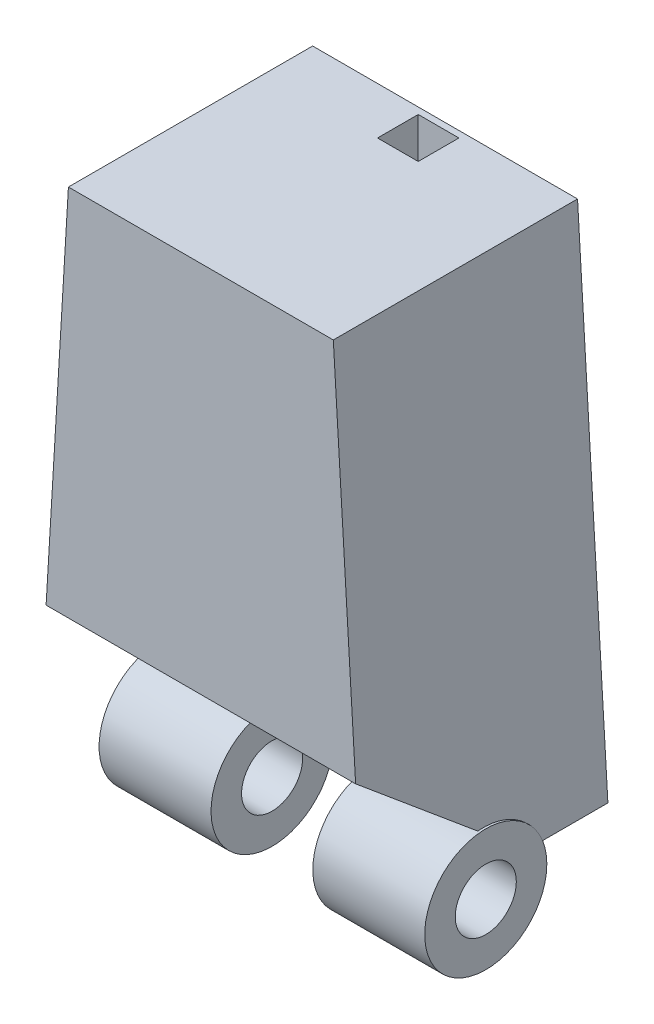
ISO-10303-21;
HEADER;
FILE_DESCRIPTION(('STEP AP214'),'2;1');
FILE_NAME('part.step','',(''),(''),'','','');
FILE_SCHEMA(('AUTOMOTIVE_DESIGN { 1 0 10303 214 1 1 1 1 }'));
ENDSEC;
DATA;
#1=APPLICATION_CONTEXT('core data for automotive mechanical design processes');
#2=APPLICATION_PROTOCOL_DEFINITION('international standard','automotive_design',2000,#1);
#3=PRODUCT_CONTEXT('',#1,'mechanical');
#4=PRODUCT('Part','Part','',(#3));
#5=PRODUCT_RELATED_PRODUCT_CATEGORY('part','',(#4));
#6=PRODUCT_DEFINITION_FORMATION('','',#4);
#7=PRODUCT_DEFINITION_CONTEXT('part definition',#1,'design');
#8=PRODUCT_DEFINITION('design','',#6,#7);
#9=PRODUCT_DEFINITION_SHAPE('','',#8);
#10=(LENGTH_UNIT() NAMED_UNIT(*) SI_UNIT(.MILLI.,.METRE.));
#11=(NAMED_UNIT(*) PLANE_ANGLE_UNIT() SI_UNIT($,.RADIAN.));
#12=(NAMED_UNIT(*) SI_UNIT($,.STERADIAN.) SOLID_ANGLE_UNIT());
#13=UNCERTAINTY_MEASURE_WITH_UNIT(LENGTH_MEASURE(1.E-05),#10,'distance_accuracy_value','');
#14=(GEOMETRIC_REPRESENTATION_CONTEXT(3) GLOBAL_UNCERTAINTY_ASSIGNED_CONTEXT((#13)) GLOBAL_UNIT_ASSIGNED_CONTEXT((#10,
#11,#12)) REPRESENTATION_CONTEXT('',''));
#15=CARTESIAN_POINT('',(0.,0.,0.));
#16=DIRECTION('',(0.,0.,1.));
#17=DIRECTION('',(1.,0.,0.));
#18=AXIS2_PLACEMENT_3D('',#15,#16,#17);
#19=CARTESIAN_POINT('',(-56.5742777997626,0.,12.));
#20=DIRECTION('',(0.,1.,0.));
#21=DIRECTION('',(0.,0.,1.));
#22=AXIS2_PLACEMENT_3D('',#19,#20,#21);
#23=PLANE('',#22);
#24=DIRECTION('',(-1.,0.,0.));
#25=VECTOR('',#24,1.);
#26=CARTESIAN_POINT('',(-40.5742777997626,0.,3.20894285260943));
#27=LINE('',#26,#25);
#28=CARTESIAN_POINT('',(-56.5742777997626,0.,3.20894285260943));
#29=VERTEX_POINT('',#28);
#30=CARTESIAN_POINT('',(-51.0742777997626,0.,3.20894285260943));
#31=VERTEX_POINT('',#30);
#32=EDGE_CURVE('E279',#29,#31,#27,.F.);
#33=ORIENTED_EDGE('',*,*,#32,.F.);
#34=DIRECTION('',(0.,0.,-1.));
#35=VECTOR('',#34,1.);
#36=CARTESIAN_POINT('',(-56.5742777997626,0.,12.));
#37=LINE('',#36,#35);
#38=CARTESIAN_POINT('',(-56.5742777997626,0.,0.));
#39=VERTEX_POINT('',#38);
#40=EDGE_CURVE('E325',#29,#39,#37,.T.);
#41=ORIENTED_EDGE('',*,*,#40,.T.);
#42=DIRECTION('',(1.,0.,0.));
#43=VECTOR('',#42,1.);
#44=CARTESIAN_POINT('',(-56.5742777997626,0.,0.));
#45=LINE('',#44,#43);
#46=CARTESIAN_POINT('',(-40.5742777997626,0.,0.));
#47=VERTEX_POINT('',#46);
#48=EDGE_CURVE('E309',#39,#47,#45,.T.);
#49=ORIENTED_EDGE('',*,*,#48,.T.);
#50=DIRECTION('',(0.,0.,-1.));
#51=VECTOR('',#50,1.);
#52=CARTESIAN_POINT('',(-40.5742777997626,0.,12.));
#53=LINE('',#52,#51);
#54=CARTESIAN_POINT('',(-40.5742777997626,0.,3.20894285260943));
#55=VERTEX_POINT('',#54);
#56=EDGE_CURVE('E322',#55,#47,#53,.T.);
#57=ORIENTED_EDGE('',*,*,#56,.F.);
#58=CARTESIAN_POINT('',(-46.0742777997626,0.,3.20894285260943));
#59=VERTEX_POINT('',#58);
#60=EDGE_CURVE('E278',#59,#55,#27,.F.);
#61=ORIENTED_EDGE('',*,*,#60,.F.);
#62=EDGE_CURVE('E284',#31,#59,#27,.F.);
#63=ORIENTED_EDGE('',*,*,#62,.F.);
#64=EDGE_LOOP('',(#33,#41,#49,#57,#61,#63));
#65=FACE_BOUND('',#64,.T.);
#66=DIRECTION('',(0.,0.,1.));
#67=VECTOR('',#66,1.);
#68=CARTESIAN_POINT('',(-49.5742777997626,0.,0.));
#69=LINE('',#68,#67);
#70=CARTESIAN_POINT('',(-49.5742777997626,0.,0.32));
#71=VERTEX_POINT('',#70);
#72=CARTESIAN_POINT('',(-49.5742777997626,0.,2.32));
#73=VERTEX_POINT('',#72);
#74=EDGE_CURVE('E159',#71,#73,#69,.T.);
#75=ORIENTED_EDGE('',*,*,#74,.T.);
#76=DIRECTION('',(1.,0.,0.));
#77=VECTOR('',#76,1.);
#78=CARTESIAN_POINT('',(-49.5742777997626,0.,2.32));
#79=LINE('',#78,#77);
#80=CARTESIAN_POINT('',(-47.5742777997626,0.,2.32));
#81=VERTEX_POINT('',#80);
#82=EDGE_CURVE('E167',#73,#81,#79,.T.);
#83=ORIENTED_EDGE('',*,*,#82,.T.);
#84=DIRECTION('',(0.,0.,1.));
#85=VECTOR('',#84,1.);
#86=CARTESIAN_POINT('',(-47.5742777997626,0.,0.));
#87=LINE('',#86,#85);
#88=CARTESIAN_POINT('',(-47.5742777997626,0.,0.319999999999999));
#89=VERTEX_POINT('',#88);
#90=EDGE_CURVE('E181',#89,#81,#87,.T.);
#91=ORIENTED_EDGE('',*,*,#90,.F.);
#92=DIRECTION('',(1.,0.,0.));
#93=VECTOR('',#92,1.);
#94=CARTESIAN_POINT('',(-49.5742777997626,0.,0.32));
#95=LINE('',#94,#93);
#96=EDGE_CURVE('E56',#71,#89,#95,.T.);
#97=ORIENTED_EDGE('',*,*,#96,.F.);
#98=EDGE_LOOP('',(#75,#83,#91,#97));
#99=FACE_BOUND('',#98,.T.);
#100=ADVANCED_FACE('F40',(#65,#99),#23,.F.);
#101=CARTESIAN_POINT('',(-56.5742777997626,24.9554191747887,12.));
#102=DIRECTION('',(0.,-1.,0.));
#103=DIRECTION('',(0.,0.,-1.));
#104=AXIS2_PLACEMENT_3D('',#101,#102,#103);
#105=PLANE('',#104);
#106=DIRECTION('',(1.,0.,0.));
#107=VECTOR('',#106,1.);
#108=CARTESIAN_POINT('',(-56.5742777997626,24.9554191747887,12.));
#109=LINE('',#108,#107);
#110=CARTESIAN_POINT('',(-55.0819461306661,24.9554191747887,12.));
#111=VERTEX_POINT('',#110);
#112=CARTESIAN_POINT('',(-42.0666094688591,24.9554191747887,12.));
#113=VERTEX_POINT('',#112);
#114=EDGE_CURVE('E187',#111,#113,#109,.T.);
#115=ORIENTED_EDGE('',*,*,#114,.T.);
#116=DIRECTION('',(0.,0.,-1.));
#117=VECTOR('',#116,1.);
#118=CARTESIAN_POINT('',(-42.0666094688591,24.9554191747887,12.));
#119=LINE('',#118,#117);
#120=CARTESIAN_POINT('',(-42.0666094688591,24.9554191747887,0.));
#121=VERTEX_POINT('',#120);
#122=EDGE_CURVE('E319',#113,#121,#119,.T.);
#123=ORIENTED_EDGE('',*,*,#122,.T.);
#124=DIRECTION('',(1.,0.,0.));
#125=VECTOR('',#124,1.);
#126=CARTESIAN_POINT('',(-48.5742777997626,24.9554191747887,0.));
#127=LINE('',#126,#125);
#128=CARTESIAN_POINT('',(-55.0819461306661,24.9554191747887,0.));
#129=VERTEX_POINT('',#128);
#130=EDGE_CURVE('E342',#129,#121,#127,.T.);
#131=ORIENTED_EDGE('',*,*,#130,.F.);
#132=DIRECTION('',(0.,0.,-1.));
#133=VECTOR('',#132,1.);
#134=CARTESIAN_POINT('',(-55.0819461306661,24.9554191747887,12.));
#135=LINE('',#134,#133);
#136=EDGE_CURVE('E305',#111,#129,#135,.T.);
#137=ORIENTED_EDGE('',*,*,#136,.F.);
#138=EDGE_LOOP('',(#115,#123,#131,#137));
#139=FACE_BOUND('',#138,.T.);
#140=DIRECTION('',(0.,0.,1.));
#141=VECTOR('',#140,1.);
#142=CARTESIAN_POINT('',(-49.5742777997626,24.9554191747887,12.));
#143=LINE('',#142,#141);
#144=CARTESIAN_POINT('',(-49.5742777997626,24.9554191747887,0.32));
#145=VERTEX_POINT('',#144);
#146=CARTESIAN_POINT('',(-49.5742777997626,24.9554191747887,2.32));
#147=VERTEX_POINT('',#146);
#148=EDGE_CURVE('E11',#145,#147,#143,.T.);
#149=ORIENTED_EDGE('',*,*,#148,.F.);
#150=DIRECTION('',(-1.,0.,0.));
#151=VECTOR('',#150,1.);
#152=CARTESIAN_POINT('',(-56.5742777997626,24.9554191747887,0.320000000000001));
#153=LINE('',#152,#151);
#154=CARTESIAN_POINT('',(-47.5742777997626,24.9554191747887,0.32));
#155=VERTEX_POINT('',#154);
#156=EDGE_CURVE('E49',#155,#145,#153,.T.);
#157=ORIENTED_EDGE('',*,*,#156,.F.);
#158=DIRECTION('',(0.,0.,1.));
#159=VECTOR('',#158,1.);
#160=CARTESIAN_POINT('',(-47.5742777997626,24.9554191747887,12.));
#161=LINE('',#160,#159);
#162=CARTESIAN_POINT('',(-47.5742777997626,24.9554191747887,2.32));
#163=VERTEX_POINT('',#162);
#164=EDGE_CURVE('E346',#155,#163,#161,.T.);
#165=ORIENTED_EDGE('',*,*,#164,.T.);
#166=DIRECTION('',(-1.,0.,0.));
#167=VECTOR('',#166,1.);
#168=CARTESIAN_POINT('',(-56.5742777997626,24.9554191747887,2.32));
#169=LINE('',#168,#167);
#170=EDGE_CURVE('E350',#163,#147,#169,.T.);
#171=ORIENTED_EDGE('',*,*,#170,.T.);
#172=EDGE_LOOP('',(#149,#157,#165,#171));
#173=FACE_BOUND('',#172,.T.);
#174=ADVANCED_FACE('F356',(#139,#173),#105,.F.);
#175=CARTESIAN_POINT('',(-56.5742777997626,-1.96433929006934,1.62400644488252));
#176=DIRECTION('',(0.,0.770712909441233,-0.637182557216242));
#177=DIRECTION('',(0.,0.637182557216242,0.770712909441233));
#178=AXIS2_PLACEMENT_3D('',#175,#176,#177);
#179=PLANE('',#178);
#180=DIRECTION('',(-1.,0.,0.));
#181=VECTOR('',#180,1.);
#182=CARTESIAN_POINT('',(-40.5742777997626,1.88670778135651,6.28209329801413));
#183=LINE('',#182,#181);
#184=CARTESIAN_POINT('',(-40.687102743825,1.88670778135651,6.28209329801413));
#185=VERTEX_POINT('',#184);
#186=CARTESIAN_POINT('',(-46.0742777997626,1.88670778135651,6.28209329801413));
#187=VERTEX_POINT('',#186);
#188=EDGE_CURVE('E333',#185,#187,#183,.T.);
#189=ORIENTED_EDGE('',*,*,#188,.F.);
#190=DIRECTION('',(0.0380758250929245,-0.636720506102474,-0.770154029173452));
#191=VECTOR('',#190,1.);
#192=CARTESIAN_POINT('',(-40.8088718006379,3.92298290585744,8.74509782921682));
#193=LINE('',#192,#191);
#194=CARTESIAN_POINT('',(-40.9697916699819,6.6139549439046,12.));
#195=VERTEX_POINT('',#194);
#196=EDGE_CURVE('E288',#195,#185,#193,.T.);
#197=ORIENTED_EDGE('',*,*,#196,.F.);
#198=DIRECTION('',(-1.,0.,0.));
#199=VECTOR('',#198,1.);
#200=CARTESIAN_POINT('',(-48.5742777997626,6.6139549439046,12.));
#201=LINE('',#200,#199);
#202=CARTESIAN_POINT('',(-56.1787639295432,6.61395494390459,12.));
#203=VERTEX_POINT('',#202);
#204=EDGE_CURVE('E328',#195,#203,#201,.T.);
#205=ORIENTED_EDGE('',*,*,#204,.T.);
#206=DIRECTION('',(0.0380758250929247,0.636720506102474,0.770154029173452));
#207=VECTOR('',#206,1.);
#208=CARTESIAN_POINT('',(-56.3396837988872,3.92298290585744,8.74509782921682));
#209=LINE('',#208,#207);
#210=CARTESIAN_POINT('',(-56.4614528557002,1.88670778135651,6.28209329801413));
#211=VERTEX_POINT('',#210);
#212=EDGE_CURVE('E292',#211,#203,#209,.T.);
#213=ORIENTED_EDGE('',*,*,#212,.F.);
#214=CARTESIAN_POINT('',(-51.0742777997626,1.88670778135651,6.28209329801413));
#215=VERTEX_POINT('',#214);
#216=EDGE_CURVE('E332',#215,#211,#183,.T.);
#217=ORIENTED_EDGE('',*,*,#216,.F.);
#218=EDGE_CURVE('E338',#187,#215,#183,.T.);
#219=ORIENTED_EDGE('',*,*,#218,.F.);
#220=EDGE_LOOP('',(#189,#197,#205,#213,#217,#219));
#221=FACE_BOUND('',#220,.T.);
#222=DIRECTION('',(0.,-0.637182557216242,-0.770712909441233));
#223=VECTOR('',#222,1.);
#224=CARTESIAN_POINT('',(-53.5742777997626,2.61388104101718,7.16165569700607));
#225=LINE('',#224,#223);
#226=CARTESIAN_POINT('',(-53.5742777997626,5.79979382709839,11.0152202442122));
#227=VERTEX_POINT('',#226);
#228=CARTESIAN_POINT('',(-53.5742777997626,2.61388104101718,7.16165569700607));
#229=VERTEX_POINT('',#228);
#230=EDGE_CURVE('E209',#227,#229,#225,.T.);
#231=ORIENTED_EDGE('',*,*,#230,.F.);
#232=DIRECTION('',(1.,0.,0.));
#233=VECTOR('',#232,1.);
#234=CARTESIAN_POINT('',(-53.5742777997626,5.79979382709839,11.0152202442122));
#235=LINE('',#234,#233);
#236=CARTESIAN_POINT('',(-43.5742777997626,5.79979382709839,11.0152202442122));
#237=VERTEX_POINT('',#236);
#238=EDGE_CURVE('E232',#227,#237,#235,.T.);
#239=ORIENTED_EDGE('',*,*,#238,.T.);
#240=DIRECTION('',(0.,-0.637182557216242,-0.770712909441233));
#241=VECTOR('',#240,1.);
#242=CARTESIAN_POINT('',(-43.5742777997626,2.61388104101718,7.16165569700607));
#243=LINE('',#242,#241);
#244=CARTESIAN_POINT('',(-43.5742777997626,2.61388104101718,7.16165569700607));
#245=VERTEX_POINT('',#244);
#246=EDGE_CURVE('E201',#237,#245,#243,.T.);
#247=ORIENTED_EDGE('',*,*,#246,.T.);
#248=DIRECTION('',(1.,0.,0.));
#249=VECTOR('',#248,1.);
#250=CARTESIAN_POINT('',(-53.5742777997626,2.61388104101718,7.16165569700607));
#251=LINE('',#250,#249);
#252=EDGE_CURVE('E227',#229,#245,#251,.T.);
#253=ORIENTED_EDGE('',*,*,#252,.F.);
#254=EDGE_LOOP('',(#231,#239,#247,#253));
#255=FACE_BOUND('',#254,.T.);
#256=ADVANCED_FACE('F371',(#221,#255),#179,.F.);
#257=CARTESIAN_POINT('',(-40.5742777997626,-1.1,6.));
#258=DIRECTION('',(-1.,0.,0.));
#259=DIRECTION('',(0.,0.,1.));
#260=AXIS2_PLACEMENT_3D('',#257,#258,#259);
#261=CYLINDRICAL_SURFACE('',#260,3.);
#262=CARTESIAN_POINT('',(-51.0742777997626,-1.1,6.));
#263=DIRECTION('',(1.,0.,0.));
#264=DIRECTION('',(0.,0.,-1.));
#265=AXIS2_PLACEMENT_3D('',#262,#263,#264);
#266=CIRCLE('',#265,3.);
#267=EDGE_CURVE('E246',#215,#31,#266,.T.);
#268=ORIENTED_EDGE('',*,*,#267,.F.);
#269=ORIENTED_EDGE('',*,*,#216,.T.);
#270=CARTESIAN_POINT('',(-56.6400576940817,-1.1,6.));
#271=DIRECTION('',(0.998216766991548,-0.05969326676386,0.));
#272=DIRECTION('',(-0.05969326676386,-0.998216766991548,0.));
#273=AXIS2_PLACEMENT_3D('',#270,#271,#272);
#274=ELLIPSE('',#273,3.00535925582725,3.);
#275=EDGE_CURVE('E283',#211,#29,#274,.F.);
#276=ORIENTED_EDGE('',*,*,#275,.T.);
#277=CARTESIAN_POINT('',(-56.5742777997626,-1.1,6.));
#278=DIRECTION('',(1.,0.,0.));
#279=DIRECTION('',(0.,0.,-1.));
#280=AXIS2_PLACEMENT_3D('',#277,#278,#279);
#281=CIRCLE('',#280,3.);
#282=EDGE_CURVE('E250',#29,#29,#281,.T.);
#283=ORIENTED_EDGE('',*,*,#282,.T.);
#284=ORIENTED_EDGE('',*,*,#32,.T.);
#285=EDGE_LOOP('',(#268,#269,#276,#283,#284));
#286=FACE_BOUND('',#285,.T.);
#287=ADVANCED_FACE('F389',(#286),#261,.T.);
#288=CARTESIAN_POINT('',(-40.5742777997626,-1.1,6.));
#289=DIRECTION('',(-1.,0.,0.));
#290=DIRECTION('',(0.,0.,1.));
#291=AXIS2_PLACEMENT_3D('',#288,#289,#290);
#292=CYLINDRICAL_SURFACE('',#291,1.5);
#293=CARTESIAN_POINT('',(-56.5742777997626,-1.1,6.));
#294=DIRECTION('',(1.,0.,0.));
#295=DIRECTION('',(0.,0.,-1.));
#296=AXIS2_PLACEMENT_3D('',#293,#294,#295);
#297=CIRCLE('',#296,1.5);
#298=CARTESIAN_POINT('',(-56.5742777997626,-1.1,4.5));
#299=VERTEX_POINT('',#298);
#300=EDGE_CURVE('E264',#299,#299,#297,.T.);
#301=ORIENTED_EDGE('',*,*,#300,.F.);
#302=EDGE_LOOP('',(#301));
#303=FACE_BOUND('',#302,.T.);
#304=CARTESIAN_POINT('',(-51.0742777997626,-1.1,6.));
#305=DIRECTION('',(1.,0.,0.));
#306=DIRECTION('',(0.,0.,-1.));
#307=AXIS2_PLACEMENT_3D('',#304,#305,#306);
#308=CIRCLE('',#307,1.5);
#309=CARTESIAN_POINT('',(-51.0742777997626,-1.1,4.5));
#310=VERTEX_POINT('',#309);
#311=EDGE_CURVE('E245',#310,#310,#308,.T.);
#312=ORIENTED_EDGE('',*,*,#311,.T.);
#313=EDGE_LOOP('',(#312));
#314=FACE_BOUND('',#313,.T.);
#315=ADVANCED_FACE('F399',(#303,#314),#292,.F.);
#316=CARTESIAN_POINT('',(-56.5742777997626,0.,12.));
#317=DIRECTION('',(0.998216766991548,-0.05969326676386,0.));
#318=DIRECTION('',(0.05969326676386,0.998216766991548,0.));
#319=AXIS2_PLACEMENT_3D('',#316,#317,#318);
#320=PLANE('',#319);
#321=ORIENTED_EDGE('',*,*,#275,.F.);
#322=ORIENTED_EDGE('',*,*,#212,.T.);
#323=DIRECTION('',(-0.05969326676386,-0.998216766991548,0.));
#324=VECTOR('',#323,1.);
#325=CARTESIAN_POINT('',(-56.5742777997626,0.,12.));
#326=LINE('',#325,#324);
#327=EDGE_CURVE('E296',#111,#203,#326,.T.);
#328=ORIENTED_EDGE('',*,*,#327,.F.);
#329=ORIENTED_EDGE('',*,*,#136,.T.);
#330=DIRECTION('',(-0.05969326676386,-0.998216766991548,0.));
#331=VECTOR('',#330,1.);
#332=CARTESIAN_POINT('',(-56.5742777997626,0.,0.));
#333=LINE('',#332,#331);
#334=EDGE_CURVE('E295',#129,#39,#333,.T.);
#335=ORIENTED_EDGE('',*,*,#334,.T.);
#336=ORIENTED_EDGE('',*,*,#40,.F.);
#337=EDGE_LOOP('',(#321,#322,#328,#329,#335,#336));
#338=FACE_BOUND('',#337,.T.);
#339=ADVANCED_FACE('F42',(#338),#320,.F.);
#340=CARTESIAN_POINT('',(-40.5742777997626,0.,12.));
#341=DIRECTION('',(-0.998216766991548,-0.0596932667638597,0.));
#342=DIRECTION('',(0.0596932667638597,-0.998216766991548,0.));
#343=AXIS2_PLACEMENT_3D('',#340,#341,#342);
#344=PLANE('',#343);
#345=CARTESIAN_POINT('',(-40.5084979054435,-1.1,6.));
#346=DIRECTION('',(-0.998216766991548,-0.0596932667638597,0.));
#347=DIRECTION('',(-0.0596932667638597,0.998216766991548,0.));
#348=AXIS2_PLACEMENT_3D('',#345,#346,#347);
#349=ELLIPSE('',#348,3.00535925582725,3.);
#350=EDGE_CURVE('E268',#55,#185,#349,.F.);
#351=ORIENTED_EDGE('',*,*,#350,.F.);
#352=ORIENTED_EDGE('',*,*,#56,.T.);
#353=DIRECTION('',(-0.0596932667638597,0.998216766991548,0.));
#354=VECTOR('',#353,1.);
#355=CARTESIAN_POINT('',(-40.5742777997626,0.,0.));
#356=LINE('',#355,#354);
#357=EDGE_CURVE('E301',#47,#121,#356,.T.);
#358=ORIENTED_EDGE('',*,*,#357,.T.);
#359=ORIENTED_EDGE('',*,*,#122,.F.);
#360=DIRECTION('',(-0.0596932667638597,0.998216766991548,0.));
#361=VECTOR('',#360,1.);
#362=CARTESIAN_POINT('',(-40.5742777997626,0.,12.));
#363=LINE('',#362,#361);
#364=EDGE_CURVE('E300',#195,#113,#363,.T.);
#365=ORIENTED_EDGE('',*,*,#364,.F.);
#366=ORIENTED_EDGE('',*,*,#196,.T.);
#367=EDGE_LOOP('',(#351,#352,#358,#359,#365,#366));
#368=FACE_BOUND('',#367,.T.);
#369=ADVANCED_FACE('F375',(#368),#344,.F.);
#370=CARTESIAN_POINT('',(-48.5742777997626,24.9554191747887,12.));
#371=DIRECTION('',(0.,0.,1.));
#372=DIRECTION('',(1.,0.,0.));
#373=AXIS2_PLACEMENT_3D('',#370,#371,#372);
#374=PLANE('',#373);
#375=ORIENTED_EDGE('',*,*,#114,.F.);
#376=ORIENTED_EDGE('',*,*,#327,.T.);
#377=ORIENTED_EDGE('',*,*,#204,.F.);
#378=ORIENTED_EDGE('',*,*,#364,.T.);
#379=EDGE_LOOP('',(#375,#376,#377,#378));
#380=FACE_BOUND('',#379,.T.);
#381=ADVANCED_FACE('F378',(#380),#374,.T.);
#382=CARTESIAN_POINT('',(-48.5742777997626,24.9554191747887,0.));
#383=DIRECTION('',(0.,0.,1.));
#384=DIRECTION('',(1.,0.,0.));
#385=AXIS2_PLACEMENT_3D('',#382,#383,#384);
#386=PLANE('',#385);
#387=ORIENTED_EDGE('',*,*,#334,.F.);
#388=ORIENTED_EDGE('',*,*,#130,.T.);
#389=ORIENTED_EDGE('',*,*,#357,.F.);
#390=ORIENTED_EDGE('',*,*,#48,.F.);
#391=EDGE_LOOP('',(#387,#388,#389,#390));
#392=FACE_BOUND('',#391,.T.);
#393=ADVANCED_FACE('F380',(#392),#386,.F.);
#394=ORIENTED_EDGE('',*,*,#188,.T.);
#395=CARTESIAN_POINT('',(-46.0742777997626,-1.1,6.));
#396=DIRECTION('',(1.,0.,0.));
#397=DIRECTION('',(0.,0.,-1.));
#398=AXIS2_PLACEMENT_3D('',#395,#396,#397);
#399=CIRCLE('',#398,3.);
#400=EDGE_CURVE('E231',#187,#59,#399,.T.);
#401=ORIENTED_EDGE('',*,*,#400,.T.);
#402=ORIENTED_EDGE('',*,*,#60,.T.);
#403=CARTESIAN_POINT('',(-40.5742777997626,-1.1,6.));
#404=DIRECTION('',(1.,0.,0.));
#405=DIRECTION('',(0.,0.,-1.));
#406=AXIS2_PLACEMENT_3D('',#403,#404,#405);
#407=CIRCLE('',#406,3.);
#408=EDGE_CURVE('E259',#55,#55,#407,.T.);
#409=ORIENTED_EDGE('',*,*,#408,.F.);
#410=ORIENTED_EDGE('',*,*,#350,.T.);
#411=EDGE_LOOP('',(#394,#401,#402,#409,#410));
#412=FACE_BOUND('',#411,.T.);
#413=ADVANCED_FACE('F382',(#412),#261,.T.);
#414=CARTESIAN_POINT('',(-46.0742777997626,-1.1,6.));
#415=DIRECTION('',(1.,0.,0.));
#416=DIRECTION('',(0.,0.,-1.));
#417=AXIS2_PLACEMENT_3D('',#414,#415,#416);
#418=CIRCLE('',#417,1.5);
#419=CARTESIAN_POINT('',(-46.0742777997626,-1.1,4.5));
#420=VERTEX_POINT('',#419);
#421=EDGE_CURVE('E255',#420,#420,#418,.T.);
#422=ORIENTED_EDGE('',*,*,#421,.F.);
#423=EDGE_LOOP('',(#422));
#424=FACE_BOUND('',#423,.T.);
#425=CARTESIAN_POINT('',(-40.5742777997626,-1.1,6.));
#426=DIRECTION('',(1.,0.,0.));
#427=DIRECTION('',(0.,0.,-1.));
#428=AXIS2_PLACEMENT_3D('',#425,#426,#427);
#429=CIRCLE('',#428,1.5);
#430=CARTESIAN_POINT('',(-40.5742777997626,-1.1,4.5));
#431=VERTEX_POINT('',#430);
#432=EDGE_CURVE('E263',#431,#431,#429,.T.);
#433=ORIENTED_EDGE('',*,*,#432,.T.);
#434=EDGE_LOOP('',(#433));
#435=FACE_BOUND('',#434,.T.);
#436=ADVANCED_FACE('F393',(#424,#435),#292,.F.);
#437=CARTESIAN_POINT('',(-40.5742777997626,0.,0.));
#438=DIRECTION('',(1.,0.,0.));
#439=DIRECTION('',(0.,0.,-1.));
#440=AXIS2_PLACEMENT_3D('',#437,#438,#439);
#441=PLANE('',#440);
#442=ORIENTED_EDGE('',*,*,#408,.T.);
#443=EDGE_LOOP('',(#442));
#444=FACE_BOUND('',#443,.T.);
#445=ORIENTED_EDGE('',*,*,#432,.F.);
#446=EDGE_LOOP('',(#445));
#447=FACE_BOUND('',#446,.T.);
#448=ADVANCED_FACE('F397',(#444,#447),#441,.T.);
#449=CARTESIAN_POINT('',(-56.5742777997626,0.,0.));
#450=DIRECTION('',(1.,0.,0.));
#451=DIRECTION('',(0.,0.,-1.));
#452=AXIS2_PLACEMENT_3D('',#449,#450,#451);
#453=PLANE('',#452);
#454=ORIENTED_EDGE('',*,*,#282,.F.);
#455=EDGE_LOOP('',(#454));
#456=FACE_BOUND('',#455,.T.);
#457=ORIENTED_EDGE('',*,*,#300,.T.);
#458=EDGE_LOOP('',(#457));
#459=FACE_BOUND('',#458,.T.);
#460=ADVANCED_FACE('F400',(#456,#459),#453,.F.);
#461=CARTESIAN_POINT('',(-51.0742777997626,-1.1,6.));
#462=DIRECTION('',(1.,0.,0.));
#463=DIRECTION('',(0.,0.,-1.));
#464=AXIS2_PLACEMENT_3D('',#461,#462,#463);
#465=CYLINDRICAL_SURFACE('',#464,3.);
#466=EDGE_CURVE('E251',#59,#187,#399,.T.);
#467=ORIENTED_EDGE('',*,*,#466,.T.);
#468=ORIENTED_EDGE('',*,*,#218,.T.);
#469=EDGE_CURVE('E241',#31,#215,#266,.T.);
#470=ORIENTED_EDGE('',*,*,#469,.F.);
#471=ORIENTED_EDGE('',*,*,#62,.T.);
#472=EDGE_LOOP('',(#467,#468,#470,#471));
#473=FACE_BOUND('',#472,.T.);
#474=ADVANCED_FACE('F403',(#473),#465,.F.);
#475=CARTESIAN_POINT('',(-51.0742777997626,0.,0.));
#476=DIRECTION('',(1.,0.,0.));
#477=DIRECTION('',(0.,0.,-1.));
#478=AXIS2_PLACEMENT_3D('',#475,#476,#477);
#479=PLANE('',#478);
#480=ORIENTED_EDGE('',*,*,#469,.T.);
#481=ORIENTED_EDGE('',*,*,#267,.T.);
#482=EDGE_LOOP('',(#480,#481));
#483=FACE_BOUND('',#482,.T.);
#484=ORIENTED_EDGE('',*,*,#311,.F.);
#485=EDGE_LOOP('',(#484));
#486=FACE_BOUND('',#485,.T.);
#487=ADVANCED_FACE('F410',(#483,#486),#479,.T.);
#488=CARTESIAN_POINT('',(-46.0742777997626,0.,0.));
#489=DIRECTION('',(1.,0.,0.));
#490=DIRECTION('',(0.,0.,-1.));
#491=AXIS2_PLACEMENT_3D('',#488,#489,#490);
#492=PLANE('',#491);
#493=ORIENTED_EDGE('',*,*,#466,.F.);
#494=ORIENTED_EDGE('',*,*,#400,.F.);
#495=EDGE_LOOP('',(#493,#494));
#496=FACE_BOUND('',#495,.T.);
#497=ORIENTED_EDGE('',*,*,#421,.T.);
#498=EDGE_LOOP('',(#497));
#499=FACE_BOUND('',#498,.T.);
#500=ADVANCED_FACE('F412',(#496,#499),#492,.F.);
#501=CARTESIAN_POINT('',(-53.5742777997626,2.61388104101718,7.16165569700607));
#502=DIRECTION('',(0.,-0.637182557216242,-0.770712909441233));
#503=DIRECTION('',(0.,0.770712909441233,-0.637182557216242));
#504=AXIS2_PLACEMENT_3D('',#501,#502,#503);
#505=PLANE('',#504);
#506=DIRECTION('',(0.,0.770712909441233,-0.637182557216243));
#507=VECTOR('',#506,1.);
#508=CARTESIAN_POINT('',(-43.5742777997626,2.61388104101718,7.16165569700607));
#509=LINE('',#508,#507);
#510=CARTESIAN_POINT('',(-43.5742777997626,6.46744558822334,3.97574291092486));
#511=VERTEX_POINT('',#510);
#512=EDGE_CURVE('E195',#245,#511,#509,.T.);
#513=ORIENTED_EDGE('',*,*,#512,.T.);
#514=DIRECTION('',(1.,0.,0.));
#515=VECTOR('',#514,1.);
#516=CARTESIAN_POINT('',(-53.5742777997626,6.46744558822334,3.97574291092486));
#517=LINE('',#516,#515);
#518=CARTESIAN_POINT('',(-53.5742777997626,6.46744558822334,3.97574291092486));
#519=VERTEX_POINT('',#518);
#520=EDGE_CURVE('E213',#519,#511,#517,.T.);
#521=ORIENTED_EDGE('',*,*,#520,.F.);
#522=DIRECTION('',(0.,0.770712909441233,-0.637182557216243));
#523=VECTOR('',#522,1.);
#524=CARTESIAN_POINT('',(-53.5742777997626,2.61388104101718,7.16165569700607));
#525=LINE('',#524,#523);
#526=EDGE_CURVE('E196',#229,#519,#525,.T.);
#527=ORIENTED_EDGE('',*,*,#526,.F.);
#528=ORIENTED_EDGE('',*,*,#252,.T.);
#529=EDGE_LOOP('',(#513,#521,#527,#528));
#530=FACE_BOUND('',#529,.T.);
#531=ADVANCED_FACE('F415',(#530),#505,.F.);
#532=CARTESIAN_POINT('',(-53.5742777997626,9.65335837430456,7.82930745813102));
#533=DIRECTION('',(0.,0.637182557216242,0.770712909441233));
#534=DIRECTION('',(0.,-0.770712909441233,0.637182557216243));
#535=AXIS2_PLACEMENT_3D('',#532,#533,#534);
#536=PLANE('',#535);
#537=DIRECTION('',(0.,-0.770712909441233,0.637182557216242));
#538=VECTOR('',#537,1.);
#539=CARTESIAN_POINT('',(-43.5742777997626,9.65335837430456,7.82930745813102));
#540=LINE('',#539,#538);
#541=CARTESIAN_POINT('',(-43.5742777997626,9.65335837430456,7.82930745813102));
#542=VERTEX_POINT('',#541);
#543=EDGE_CURVE('E221',#542,#237,#540,.T.);
#544=ORIENTED_EDGE('',*,*,#543,.T.);
#545=ORIENTED_EDGE('',*,*,#238,.F.);
#546=DIRECTION('',(0.,-0.770712909441233,0.637182557216242));
#547=VECTOR('',#546,1.);
#548=CARTESIAN_POINT('',(-53.5742777997626,9.65335837430456,7.82930745813102));
#549=LINE('',#548,#547);
#550=CARTESIAN_POINT('',(-53.5742777997626,9.65335837430456,7.82930745813102));
#551=VERTEX_POINT('',#550);
#552=EDGE_CURVE('E205',#551,#227,#549,.T.);
#553=ORIENTED_EDGE('',*,*,#552,.F.);
#554=DIRECTION('',(1.,0.,0.));
#555=VECTOR('',#554,1.);
#556=CARTESIAN_POINT('',(-53.5742777997626,9.65335837430456,7.82930745813102));
#557=LINE('',#556,#555);
#558=EDGE_CURVE('E236',#551,#542,#557,.T.);
#559=ORIENTED_EDGE('',*,*,#558,.T.);
#560=EDGE_LOOP('',(#544,#545,#553,#559));
#561=FACE_BOUND('',#560,.T.);
#562=ADVANCED_FACE('F422',(#561),#536,.F.);
#563=CARTESIAN_POINT('',(-53.5742777997626,6.46744558822334,3.97574291092486));
#564=DIRECTION('',(0.,0.770712909441232,-0.637182557216243));
#565=DIRECTION('',(0.,0.637182557216243,0.770712909441232));
#566=AXIS2_PLACEMENT_3D('',#563,#564,#565);
#567=PLANE('',#566);
#568=DIRECTION('',(0.,0.637182557216243,0.770712909441232));
#569=VECTOR('',#568,1.);
#570=CARTESIAN_POINT('',(-43.5742777997626,6.46744558822334,3.97574291092486));
#571=LINE('',#570,#569);
#572=EDGE_CURVE('E217',#511,#542,#571,.T.);
#573=ORIENTED_EDGE('',*,*,#572,.T.);
#574=ORIENTED_EDGE('',*,*,#558,.F.);
#575=DIRECTION('',(0.,0.637182557216243,0.770712909441232));
#576=VECTOR('',#575,1.);
#577=CARTESIAN_POINT('',(-53.5742777997626,6.46744558822334,3.97574291092486));
#578=LINE('',#577,#576);
#579=EDGE_CURVE('E200',#519,#551,#578,.T.);
#580=ORIENTED_EDGE('',*,*,#579,.F.);
#581=ORIENTED_EDGE('',*,*,#520,.T.);
#582=EDGE_LOOP('',(#573,#574,#580,#581));
#583=FACE_BOUND('',#582,.T.);
#584=ADVANCED_FACE('F424',(#583),#567,.F.);
#585=CARTESIAN_POINT('',(-53.5742777997626,0.,0.));
#586=DIRECTION('',(1.,0.,0.));
#587=DIRECTION('',(0.,0.,-1.));
#588=AXIS2_PLACEMENT_3D('',#585,#586,#587);
#589=PLANE('',#588);
#590=CARTESIAN_POINT('',(-53.5742777997626,6.17711363623363,7.54809025596646));
#591=DIRECTION('',(1.,0.,0.));
#592=DIRECTION('',(0.,0.,-1.));
#593=AXIS2_PLACEMENT_3D('',#590,#591,#592);
#594=CIRCLE('',#593,1.5);
#595=CARTESIAN_POINT('',(-53.5742777997626,6.17711363623363,6.04809025596646));
#596=VERTEX_POINT('',#595);
#597=EDGE_CURVE('E191',#596,#596,#594,.F.);
#598=ORIENTED_EDGE('',*,*,#597,.T.);
#599=EDGE_LOOP('',(#598));
#600=FACE_BOUND('',#599,.T.);
#601=ORIENTED_EDGE('',*,*,#526,.T.);
#602=ORIENTED_EDGE('',*,*,#579,.T.);
#603=ORIENTED_EDGE('',*,*,#552,.T.);
#604=ORIENTED_EDGE('',*,*,#230,.T.);
#605=EDGE_LOOP('',(#601,#602,#603,#604));
#606=FACE_BOUND('',#605,.T.);
#607=ADVANCED_FACE('F427',(#600,#606),#589,.T.);
#608=CARTESIAN_POINT('',(-43.5742777997626,0.,0.));
#609=DIRECTION('',(1.,0.,0.));
#610=DIRECTION('',(0.,0.,-1.));
#611=AXIS2_PLACEMENT_3D('',#608,#609,#610);
#612=PLANE('',#611);
#613=CARTESIAN_POINT('',(-43.5742777997626,6.17711363623363,7.54809025596646));
#614=DIRECTION('',(1.,0.,0.));
#615=DIRECTION('',(0.,0.,-1.));
#616=AXIS2_PLACEMENT_3D('',#613,#614,#615);
#617=CIRCLE('',#616,1.5);
#618=CARTESIAN_POINT('',(-43.5742777997626,6.17711363623363,6.04809025596646));
#619=VERTEX_POINT('',#618);
#620=EDGE_CURVE('E337',#619,#619,#617,.F.);
#621=ORIENTED_EDGE('',*,*,#620,.F.);
#622=EDGE_LOOP('',(#621));
#623=FACE_BOUND('',#622,.T.);
#624=ORIENTED_EDGE('',*,*,#512,.F.);
#625=ORIENTED_EDGE('',*,*,#246,.F.);
#626=ORIENTED_EDGE('',*,*,#543,.F.);
#627=ORIENTED_EDGE('',*,*,#572,.F.);
#628=EDGE_LOOP('',(#624,#625,#626,#627));
#629=FACE_BOUND('',#628,.T.);
#630=ADVANCED_FACE('F432',(#623,#629),#612,.F.);
#631=CARTESIAN_POINT('',(-43.0742777997626,6.17711363623363,7.54809025596646));
#632=DIRECTION('',(-1.,0.,0.));
#633=DIRECTION('',(0.,0.,1.));
#634=AXIS2_PLACEMENT_3D('',#631,#632,#633);
#635=CYLINDRICAL_SURFACE('',#634,1.5);
#636=ORIENTED_EDGE('',*,*,#597,.F.);
#637=EDGE_LOOP('',(#636));
#638=FACE_BOUND('',#637,.T.);
#639=ORIENTED_EDGE('',*,*,#620,.T.);
#640=EDGE_LOOP('',(#639));
#641=FACE_BOUND('',#640,.T.);
#642=ADVANCED_FACE('F435',(#638,#641),#635,.T.);
#643=CARTESIAN_POINT('',(-49.5742777997626,0.,0.32));
#644=DIRECTION('',(0.,0.,1.));
#645=DIRECTION('',(1.,0.,0.));
#646=AXIS2_PLACEMENT_3D('',#643,#644,#645);
#647=PLANE('',#646);
#648=ORIENTED_EDGE('',*,*,#156,.T.);
#649=DIRECTION('',(0.,-1.,0.));
#650=VECTOR('',#649,1.);
#651=CARTESIAN_POINT('',(-49.5742777997626,0.,0.32));
#652=LINE('',#651,#650);
#653=EDGE_CURVE('E172',#145,#71,#652,.T.);
#654=ORIENTED_EDGE('',*,*,#653,.T.);
#655=ORIENTED_EDGE('',*,*,#96,.T.);
#656=DIRECTION('',(0.,-1.,0.));
#657=VECTOR('',#656,1.);
#658=CARTESIAN_POINT('',(-47.5742777997626,0.,0.32));
#659=LINE('',#658,#657);
#660=EDGE_CURVE('E164',#155,#89,#659,.T.);
#661=ORIENTED_EDGE('',*,*,#660,.F.);
#662=EDGE_LOOP('',(#648,#654,#655,#661));
#663=FACE_BOUND('',#662,.T.);
#664=ADVANCED_FACE('F354',(#663),#647,.T.);
#665=CARTESIAN_POINT('',(-49.5742777997626,0.,2.32));
#666=DIRECTION('',(0.,0.,1.));
#667=DIRECTION('',(1.,0.,0.));
#668=AXIS2_PLACEMENT_3D('',#665,#666,#667);
#669=PLANE('',#668);
#670=DIRECTION('',(0.,-1.,0.));
#671=VECTOR('',#670,1.);
#672=CARTESIAN_POINT('',(-47.5742777997626,0.,2.32));
#673=LINE('',#672,#671);
#674=EDGE_CURVE('E64',#163,#81,#673,.T.);
#675=ORIENTED_EDGE('',*,*,#674,.T.);
#676=ORIENTED_EDGE('',*,*,#82,.F.);
#677=DIRECTION('',(0.,-1.,0.));
#678=VECTOR('',#677,1.);
#679=CARTESIAN_POINT('',(-49.5742777997626,0.,2.32));
#680=LINE('',#679,#678);
#681=EDGE_CURVE('E154',#147,#73,#680,.T.);
#682=ORIENTED_EDGE('',*,*,#681,.F.);
#683=ORIENTED_EDGE('',*,*,#170,.F.);
#684=EDGE_LOOP('',(#675,#676,#682,#683));
#685=FACE_BOUND('',#684,.T.);
#686=ADVANCED_FACE('F168',(#685),#669,.F.);
#687=CARTESIAN_POINT('',(-49.5742777997626,0.,0.));
#688=DIRECTION('',(1.,0.,0.));
#689=DIRECTION('',(0.,0.,-1.));
#690=AXIS2_PLACEMENT_3D('',#687,#688,#689);
#691=PLANE('',#690);
#692=ORIENTED_EDGE('',*,*,#148,.T.);
#693=ORIENTED_EDGE('',*,*,#681,.T.);
#694=ORIENTED_EDGE('',*,*,#74,.F.);
#695=ORIENTED_EDGE('',*,*,#653,.F.);
#696=EDGE_LOOP('',(#692,#693,#694,#695));
#697=FACE_BOUND('',#696,.T.);
#698=ADVANCED_FACE('F156',(#697),#691,.T.);
#699=CARTESIAN_POINT('',(-47.5742777997626,0.,0.));
#700=DIRECTION('',(1.,0.,0.));
#701=DIRECTION('',(0.,0.,-1.));
#702=AXIS2_PLACEMENT_3D('',#699,#700,#701);
#703=PLANE('',#702);
#704=ORIENTED_EDGE('',*,*,#660,.T.);
#705=ORIENTED_EDGE('',*,*,#90,.T.);
#706=ORIENTED_EDGE('',*,*,#674,.F.);
#707=ORIENTED_EDGE('',*,*,#164,.F.);
#708=EDGE_LOOP('',(#704,#705,#706,#707));
#709=FACE_BOUND('',#708,.T.);
#710=ADVANCED_FACE('F357',(#709),#703,.F.);
#711=CLOSED_SHELL('',(#100,#174,#256,#287,#315,#339,#369,#381,#393,#413,#436,#448,#460,#474,
#487,#500,#531,#562,#584,#607,#630,#642,#664,#686,#698,#710));
#712=MANIFOLD_SOLID_BREP('B2',#711);
#713=ADVANCED_BREP_SHAPE_REPRESENTATION('',(#18,#712),#14);
#714=SHAPE_DEFINITION_REPRESENTATION(#9,#713);
ENDSEC;
END-ISO-10303-21;
